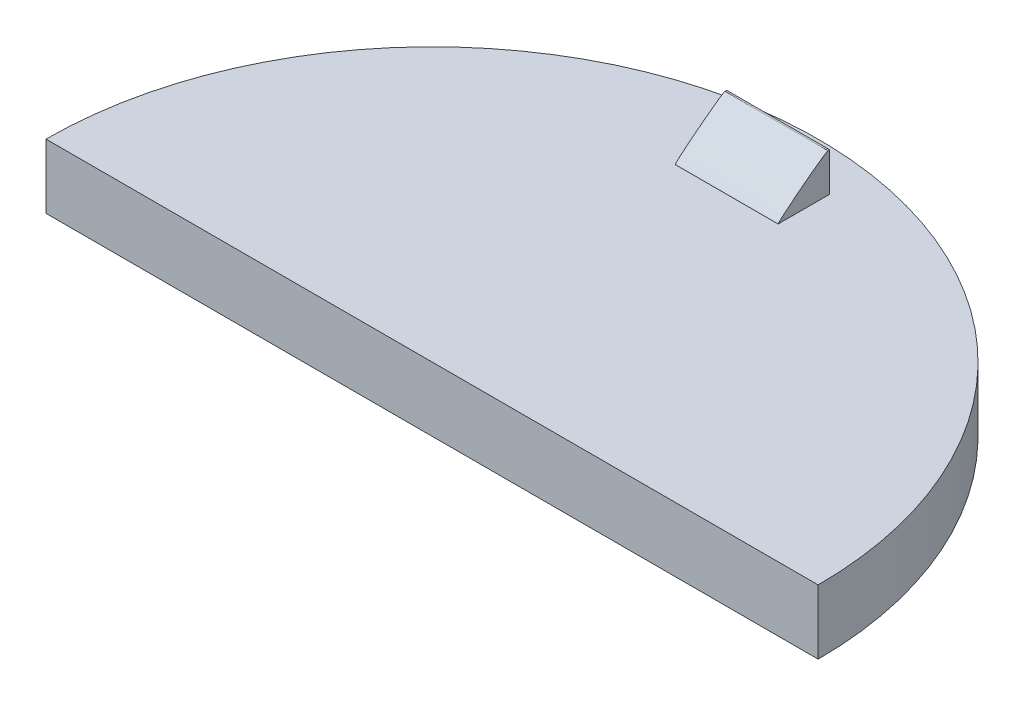
ISO-10303-21;
HEADER;
FILE_DESCRIPTION(('STEP AP214'),'2;1');
FILE_NAME('part.step','',(''),(''),'','','');
FILE_SCHEMA(('AUTOMOTIVE_DESIGN { 1 0 10303 214 1 1 1 1 }'));
ENDSEC;
DATA;
#1=APPLICATION_CONTEXT('core data for automotive mechanical design processes');
#2=APPLICATION_PROTOCOL_DEFINITION('international standard','automotive_design',2000,#1);
#3=PRODUCT_CONTEXT('',#1,'mechanical');
#4=PRODUCT('Part','Part','',(#3));
#5=PRODUCT_RELATED_PRODUCT_CATEGORY('part','',(#4));
#6=PRODUCT_DEFINITION_FORMATION('','',#4);
#7=PRODUCT_DEFINITION_CONTEXT('part definition',#1,'design');
#8=PRODUCT_DEFINITION('design','',#6,#7);
#9=PRODUCT_DEFINITION_SHAPE('','',#8);
#10=(LENGTH_UNIT() NAMED_UNIT(*) SI_UNIT(.MILLI.,.METRE.));
#11=(NAMED_UNIT(*) PLANE_ANGLE_UNIT() SI_UNIT($,.RADIAN.));
#12=(NAMED_UNIT(*) SI_UNIT($,.STERADIAN.) SOLID_ANGLE_UNIT());
#13=UNCERTAINTY_MEASURE_WITH_UNIT(LENGTH_MEASURE(1.E-05),#10,'distance_accuracy_value','');
#14=(GEOMETRIC_REPRESENTATION_CONTEXT(3) GLOBAL_UNCERTAINTY_ASSIGNED_CONTEXT((#13)) GLOBAL_UNIT_ASSIGNED_CONTEXT((#10,
#11,#12)) REPRESENTATION_CONTEXT('',''));
#15=CARTESIAN_POINT('',(0.,0.,0.));
#16=DIRECTION('',(0.,0.,1.));
#17=DIRECTION('',(1.,0.,0.));
#18=AXIS2_PLACEMENT_3D('',#15,#16,#17);
#19=CARTESIAN_POINT('',(0.,5.,0.));
#20=DIRECTION('',(0.,1.,0.));
#21=DIRECTION('',(0.,0.,1.));
#22=AXIS2_PLACEMENT_3D('',#19,#20,#21);
#23=PLANE('',#22);
#24=CARTESIAN_POINT('',(0.,5.,0.));
#25=DIRECTION('',(0.,1.,0.));
#26=DIRECTION('',(0.,0.,1.));
#27=AXIS2_PLACEMENT_3D('',#24,#25,#26);
#28=CIRCLE('',#27,30.);
#29=CARTESIAN_POINT('',(30.,5.,0.));
#30=VERTEX_POINT('',#29);
#31=CARTESIAN_POINT('',(-30.,5.,0.));
#32=VERTEX_POINT('',#31);
#33=EDGE_CURVE('E133',#30,#32,#28,.T.);
#34=ORIENTED_EDGE('',*,*,#33,.T.);
#35=DIRECTION('',(1.,0.,0.));
#36=VECTOR('',#35,1.);
#37=CARTESIAN_POINT('',(-30.,5.,0.));
#38=LINE('',#37,#36);
#39=EDGE_CURVE('E136',#32,#30,#38,.T.);
#40=ORIENTED_EDGE('',*,*,#39,.T.);
#41=EDGE_LOOP('',(#34,#40));
#42=FACE_BOUND('',#41,.T.);
#43=DIRECTION('',(-1.,0.,0.));
#44=VECTOR('',#43,1.);
#45=CARTESIAN_POINT('',(-3.84159331598207,5.,-26.7316665793187));
#46=LINE('',#45,#44);
#47=CARTESIAN_POINT('',(4.15840668401793,5.,-26.7316665793187));
#48=VERTEX_POINT('',#47);
#49=CARTESIAN_POINT('',(-3.84159331598207,5.,-26.7316665793187));
#50=VERTEX_POINT('',#49);
#51=EDGE_CURVE('E149',#48,#50,#46,.T.);
#52=ORIENTED_EDGE('',*,*,#51,.F.);
#53=DIRECTION('',(0.,0.,-1.));
#54=VECTOR('',#53,1.);
#55=CARTESIAN_POINT('',(4.15840668401793,5.,-26.7316665793187));
#56=LINE('',#55,#54);
#57=CARTESIAN_POINT('',(4.15840668401793,5.,-22.7316665793187));
#58=VERTEX_POINT('',#57);
#59=EDGE_CURVE('E123',#58,#48,#56,.T.);
#60=ORIENTED_EDGE('',*,*,#59,.F.);
#61=CARTESIAN_POINT('',(-4.24159331598207,5.,-22.7316665793187));
#62=CARTESIAN_POINT('',(-1.30825998264874,5.,-22.7316665793187));
#63=CARTESIAN_POINT('',(1.6250733506846,5.,-22.7316665793187));
#64=CARTESIAN_POINT('',(4.55840668401793,5.,-22.7316665793187));
#65=(BOUNDED_CURVE() B_SPLINE_CURVE(3,(#61,#62,#63,#64),.UNSPECIFIED.,.F.,
.F.) B_SPLINE_CURVE_WITH_KNOTS((4,4),(-0.00455840668401793,0.00424159331598207),
.UNSPECIFIED.) CURVE() GEOMETRIC_REPRESENTATION_ITEM() RATIONAL_B_SPLINE_CURVE((1.,1.,1.,1.)) REPRESENTATION_ITEM(''));
#66=CARTESIAN_POINT('',(-3.84159331598207,5.,-22.7316665793187));
#67=VERTEX_POINT('',#66);
#68=EDGE_CURVE('E111',#67,#58,#65,.T.);
#69=ORIENTED_EDGE('',*,*,#68,.F.);
#70=DIRECTION('',(0.,0.,1.));
#71=VECTOR('',#70,1.);
#72=CARTESIAN_POINT('',(-3.84159331598207,5.,-26.7316665793187));
#73=LINE('',#72,#71);
#74=EDGE_CURVE('E150',#50,#67,#73,.T.);
#75=ORIENTED_EDGE('',*,*,#74,.F.);
#76=EDGE_LOOP('',(#52,#60,#69,#75));
#77=FACE_BOUND('',#76,.T.);
#78=ADVANCED_FACE('F42',(#42,#77),#23,.T.);
#79=CARTESIAN_POINT('',(0.,5.,0.));
#80=DIRECTION('',(0.,-1.,0.));
#81=DIRECTION('',(0.,0.,-1.));
#82=AXIS2_PLACEMENT_3D('',#79,#80,#81);
#83=CYLINDRICAL_SURFACE('',#82,30.);
#84=CARTESIAN_POINT('',(0.,0.,0.));
#85=DIRECTION('',(0.,1.,0.));
#86=DIRECTION('',(0.,0.,1.));
#87=AXIS2_PLACEMENT_3D('',#84,#85,#86);
#88=CIRCLE('',#87,30.);
#89=CARTESIAN_POINT('',(30.,0.,0.));
#90=VERTEX_POINT('',#89);
#91=CARTESIAN_POINT('',(-30.,0.,0.));
#92=VERTEX_POINT('',#91);
#93=EDGE_CURVE('E125',#90,#92,#88,.T.);
#94=ORIENTED_EDGE('',*,*,#93,.T.);
#95=DIRECTION('',(0.,-1.,0.));
#96=VECTOR('',#95,1.);
#97=CARTESIAN_POINT('',(-30.,5.,0.));
#98=LINE('',#97,#96);
#99=EDGE_CURVE('E142',#32,#92,#98,.T.);
#100=ORIENTED_EDGE('',*,*,#99,.F.);
#101=ORIENTED_EDGE('',*,*,#33,.F.);
#102=DIRECTION('',(0.,-1.,0.));
#103=VECTOR('',#102,1.);
#104=CARTESIAN_POINT('',(30.,5.,0.));
#105=LINE('',#104,#103);
#106=EDGE_CURVE('E137',#30,#90,#105,.T.);
#107=ORIENTED_EDGE('',*,*,#106,.T.);
#108=EDGE_LOOP('',(#94,#100,#101,#107));
#109=FACE_BOUND('',#108,.T.);
#110=ADVANCED_FACE('F183',(#109),#83,.T.);
#111=CARTESIAN_POINT('',(-30.,5.,0.));
#112=DIRECTION('',(0.,0.,-1.));
#113=DIRECTION('',(-1.,0.,0.));
#114=AXIS2_PLACEMENT_3D('',#111,#112,#113);
#115=PLANE('',#114);
#116=DIRECTION('',(1.,0.,0.));
#117=VECTOR('',#116,1.);
#118=CARTESIAN_POINT('',(-30.,0.,0.));
#119=LINE('',#118,#117);
#120=EDGE_CURVE('E128',#92,#90,#119,.T.);
#121=ORIENTED_EDGE('',*,*,#120,.T.);
#122=ORIENTED_EDGE('',*,*,#106,.F.);
#123=ORIENTED_EDGE('',*,*,#39,.F.);
#124=ORIENTED_EDGE('',*,*,#99,.T.);
#125=EDGE_LOOP('',(#121,#122,#123,#124));
#126=FACE_BOUND('',#125,.T.);
#127=ADVANCED_FACE('F187',(#126),#115,.F.);
#128=CARTESIAN_POINT('',(0.,0.,0.));
#129=DIRECTION('',(0.,1.,0.));
#130=DIRECTION('',(0.,0.,1.));
#131=AXIS2_PLACEMENT_3D('',#128,#129,#130);
#132=PLANE('',#131);
#133=ORIENTED_EDGE('',*,*,#93,.F.);
#134=ORIENTED_EDGE('',*,*,#120,.F.);
#135=EDGE_LOOP('',(#133,#134));
#136=FACE_BOUND('',#135,.T.);
#137=ADVANCED_FACE('F179',(#136),#132,.F.);
#138=CARTESIAN_POINT('',(4.15840668401793,8.,-26.7316665793187));
#139=DIRECTION('',(-1.,0.,0.));
#140=DIRECTION('',(0.,0.,1.));
#141=AXIS2_PLACEMENT_3D('',#138,#139,#140);
#142=PLANE('',#141);
#143=DIRECTION('',(0.,0.,-1.));
#144=VECTOR('',#143,1.);
#145=CARTESIAN_POINT('',(4.15840668401793,8.,-26.7316665793187));
#146=LINE('',#145,#144);
#147=CARTESIAN_POINT('',(4.15840668401793,8.,-26.6046499255261));
#148=VERTEX_POINT('',#147);
#149=CARTESIAN_POINT('',(4.15840668401793,8.,-26.7316665793187));
#150=VERTEX_POINT('',#149);
#151=EDGE_CURVE('E102',#148,#150,#146,.T.);
#152=ORIENTED_EDGE('',*,*,#151,.F.);
#153=CARTESIAN_POINT('',(4.15840668401793,5.,-22.7316665793187));
#154=CARTESIAN_POINT('',(4.15840668401793,8.,-23.5062632485602));
#155=CARTESIAN_POINT('',(4.15840668401793,8.,-26.6046499255261));
#156=(BOUNDED_CURVE() B_SPLINE_CURVE(2,(#153,#154,#155),.UNSPECIFIED.,.F.,
.F.) B_SPLINE_CURVE_WITH_KNOTS((3,3),(0.,1.),
.UNSPECIFIED.) CURVE() GEOMETRIC_REPRESENTATION_ITEM() RATIONAL_B_SPLINE_CURVE((1.,
0.0574959574576069,1.)) REPRESENTATION_ITEM(''));
#157=EDGE_CURVE('E57',#148,#58,#156,.F.);
#158=ORIENTED_EDGE('',*,*,#157,.T.);
#159=ORIENTED_EDGE('',*,*,#59,.T.);
#160=DIRECTION('',(0.,-1.,0.));
#161=VECTOR('',#160,1.);
#162=CARTESIAN_POINT('',(4.15840668401793,8.,-26.7316665793187));
#163=LINE('',#162,#161);
#164=EDGE_CURVE('E115',#150,#48,#163,.T.);
#165=ORIENTED_EDGE('',*,*,#164,.F.);
#166=EDGE_LOOP('',(#152,#158,#159,#165));
#167=FACE_BOUND('',#166,.T.);
#168=ADVANCED_FACE('F121',(#167),#142,.F.);
#169=CARTESIAN_POINT('',(-3.84159331598207,8.,-26.7316665793187));
#170=DIRECTION('',(0.,0.,1.));
#171=DIRECTION('',(1.,0.,0.));
#172=AXIS2_PLACEMENT_3D('',#169,#170,#171);
#173=PLANE('',#172);
#174=ORIENTED_EDGE('',*,*,#51,.T.);
#175=DIRECTION('',(0.,-1.,0.));
#176=VECTOR('',#175,1.);
#177=CARTESIAN_POINT('',(-3.84159331598207,8.,-26.7316665793187));
#178=LINE('',#177,#176);
#179=CARTESIAN_POINT('',(-3.84159331598207,8.,-26.7316665793187));
#180=VERTEX_POINT('',#179);
#181=EDGE_CURVE('E118',#180,#50,#178,.T.);
#182=ORIENTED_EDGE('',*,*,#181,.F.);
#183=DIRECTION('',(-1.,0.,0.));
#184=VECTOR('',#183,1.);
#185=CARTESIAN_POINT('',(-3.84159331598207,8.,-26.7316665793187));
#186=LINE('',#185,#184);
#187=EDGE_CURVE('E105',#150,#180,#186,.T.);
#188=ORIENTED_EDGE('',*,*,#187,.F.);
#189=ORIENTED_EDGE('',*,*,#164,.T.);
#190=EDGE_LOOP('',(#174,#182,#188,#189));
#191=FACE_BOUND('',#190,.T.);
#192=ADVANCED_FACE('F114',(#191),#173,.F.);
#193=CARTESIAN_POINT('',(-3.84159331598207,8.,-26.7316665793187));
#194=DIRECTION('',(1.,0.,0.));
#195=DIRECTION('',(0.,0.,-1.));
#196=AXIS2_PLACEMENT_3D('',#193,#194,#195);
#197=PLANE('',#196);
#198=ORIENTED_EDGE('',*,*,#74,.T.);
#199=CARTESIAN_POINT('',(-3.84159331598207,8.,-26.6046499255261));
#200=CARTESIAN_POINT('',(-3.84159331598207,8.,-23.5062632485602));
#201=CARTESIAN_POINT('',(-3.84159331598207,5.,-22.7316665793187));
#202=(BOUNDED_CURVE() B_SPLINE_CURVE(2,(#199,#200,#201),.UNSPECIFIED.,.F.,
.F.) B_SPLINE_CURVE_WITH_KNOTS((3,3),(0.,1.),
.UNSPECIFIED.) CURVE() GEOMETRIC_REPRESENTATION_ITEM() RATIONAL_B_SPLINE_CURVE((1.,
0.0574959574576069,1.)) REPRESENTATION_ITEM(''));
#203=CARTESIAN_POINT('',(-3.84159331598207,8.,-26.6046499255261));
#204=VERTEX_POINT('',#203);
#205=EDGE_CURVE('E12',#67,#204,#202,.F.);
#206=ORIENTED_EDGE('',*,*,#205,.T.);
#207=DIRECTION('',(0.,0.,1.));
#208=VECTOR('',#207,1.);
#209=CARTESIAN_POINT('',(-3.84159331598207,8.,-26.7316665793187));
#210=LINE('',#209,#208);
#211=EDGE_CURVE('E119',#180,#204,#210,.T.);
#212=ORIENTED_EDGE('',*,*,#211,.F.);
#213=ORIENTED_EDGE('',*,*,#181,.T.);
#214=EDGE_LOOP('',(#198,#206,#212,#213));
#215=FACE_BOUND('',#214,.T.);
#216=ADVANCED_FACE('F165',(#215),#197,.F.);
#217=CARTESIAN_POINT('',(0.,8.,0.));
#218=DIRECTION('',(0.,1.,0.));
#219=DIRECTION('',(0.,0.,1.));
#220=AXIS2_PLACEMENT_3D('',#217,#218,#219);
#221=PLANE('',#220);
#222=ORIENTED_EDGE('',*,*,#211,.T.);
#223=CARTESIAN_POINT('',(4.55840668401793,8.,-26.6046499255261));
#224=CARTESIAN_POINT('',(1.6250733506846,8.,-26.6046499255261));
#225=CARTESIAN_POINT('',(-1.30825998264874,8.,-26.6046499255261));
#226=CARTESIAN_POINT('',(-4.24159331598207,8.,-26.6046499255261));
#227=(BOUNDED_CURVE() B_SPLINE_CURVE(3,(#223,#224,#225,#226),.UNSPECIFIED.,.F.,
.F.) B_SPLINE_CURVE_WITH_KNOTS((4,4),(-0.00455840668401793,0.00424159331598207),
.UNSPECIFIED.) CURVE() GEOMETRIC_REPRESENTATION_ITEM() RATIONAL_B_SPLINE_CURVE((1.,1.,1.,1.)) REPRESENTATION_ITEM(''));
#228=EDGE_CURVE('E107',#204,#148,#227,.F.);
#229=ORIENTED_EDGE('',*,*,#228,.T.);
#230=ORIENTED_EDGE('',*,*,#151,.T.);
#231=ORIENTED_EDGE('',*,*,#187,.T.);
#232=EDGE_LOOP('',(#222,#229,#230,#231));
#233=FACE_BOUND('',#232,.T.);
#234=ADVANCED_FACE('F104',(#233),#221,.T.);
#235=CARTESIAN_POINT('',(4.55840668401793,5.,-22.7316665793187));
#236=CARTESIAN_POINT('',(1.6250733506846,5.,-22.7316665793187));
#237=CARTESIAN_POINT('',(-1.30825998264874,5.,-22.7316665793187));
#238=CARTESIAN_POINT('',(-4.24159331598207,5.,-22.7316665793187));
#239=CARTESIAN_POINT('',(4.55840668401793,8.,-23.5062632485602));
#240=CARTESIAN_POINT('',(1.6250733506846,8.,-23.5062632485602));
#241=CARTESIAN_POINT('',(-1.30825998264874,8.,-23.5062632485602));
#242=CARTESIAN_POINT('',(-4.24159331598207,8.,-23.5062632485602));
#243=CARTESIAN_POINT('',(4.55840668401793,8.,-26.6046499255261));
#244=CARTESIAN_POINT('',(1.6250733506846,8.,-26.6046499255261));
#245=CARTESIAN_POINT('',(-1.30825998264874,8.,-26.6046499255261));
#246=CARTESIAN_POINT('',(-4.24159331598207,8.,-26.6046499255261));
#247=(BOUNDED_SURFACE() B_SPLINE_SURFACE(2,3,((#235,#236,#237,#238),(#239,#240,#241,#242),(#243,
#244,#245,#246)),.UNSPECIFIED.,.F.,.F.,.F.) B_SPLINE_SURFACE_WITH_KNOTS((3,3),(4,4),(0.,1.),
(-0.00455840668401793,0.00424159331598207),
.UNSPECIFIED.) GEOMETRIC_REPRESENTATION_ITEM() RATIONAL_B_SPLINE_SURFACE(((1.,1.,1.,1.),
(0.0574959574576069,0.0574959574576069,0.0574959574576069,0.0574959574576069),(1.,1.,1.,1.))) REPRESENTATION_ITEM('') SURFACE());
#248=ORIENTED_EDGE('',*,*,#205,.F.);
#249=ORIENTED_EDGE('',*,*,#68,.T.);
#250=ORIENTED_EDGE('',*,*,#157,.F.);
#251=ORIENTED_EDGE('',*,*,#228,.F.);
#252=EDGE_LOOP('',(#248,#249,#250,#251));
#253=FACE_BOUND('',#252,.T.);
#254=ADVANCED_FACE('F45',(#253),#247,.T.);
#255=CLOSED_SHELL('',(#78,#110,#127,#137,#168,#192,#216,#234,#254));
#256=MANIFOLD_SOLID_BREP('B2',#255);
#257=ADVANCED_BREP_SHAPE_REPRESENTATION('',(#18,#256),#14);
#258=SHAPE_DEFINITION_REPRESENTATION(#9,#257);
ENDSEC;
END-ISO-10303-21;
